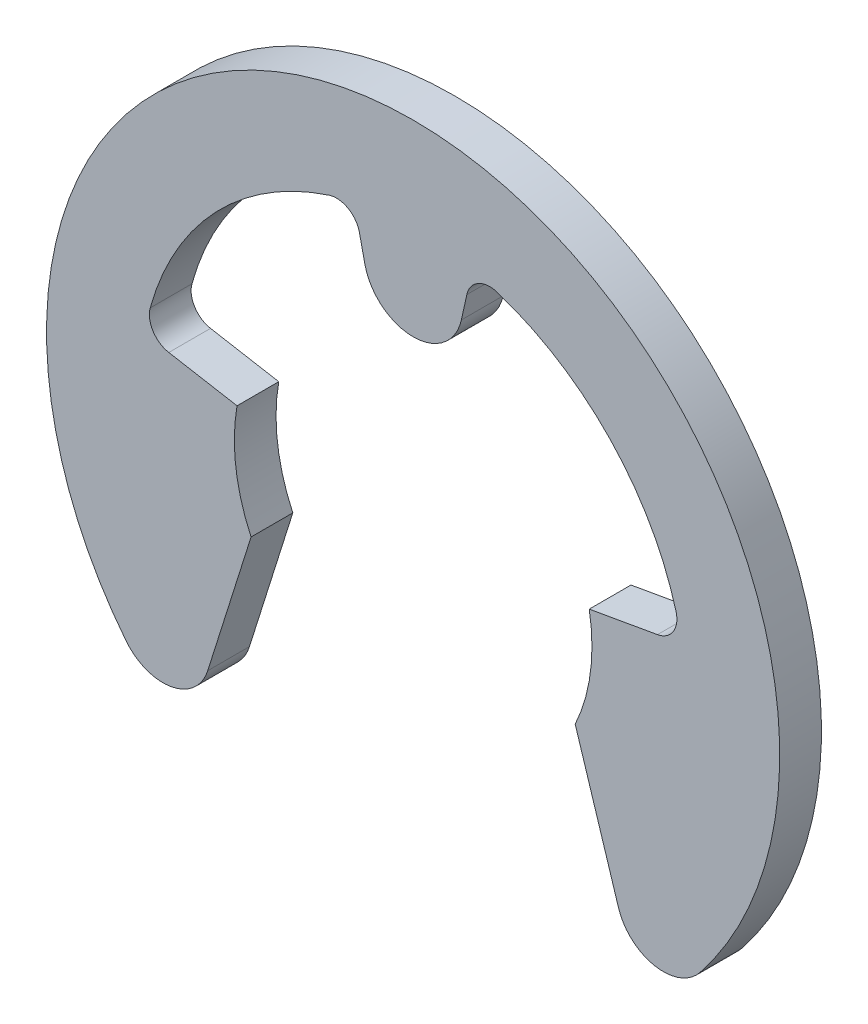
ISO-10303-21;
HEADER;
FILE_DESCRIPTION(('STEP AP214'),'2;1');
FILE_NAME('part.step','',(''),(''),'','','');
FILE_SCHEMA(('AUTOMOTIVE_DESIGN { 1 0 10303 214 1 1 1 1 }'));
ENDSEC;
DATA;
#1=APPLICATION_CONTEXT('core data for automotive mechanical design processes');
#2=APPLICATION_PROTOCOL_DEFINITION('international standard','automotive_design',2000,#1);
#3=PRODUCT_CONTEXT('',#1,'mechanical');
#4=PRODUCT('Part','Part','',(#3));
#5=PRODUCT_RELATED_PRODUCT_CATEGORY('part','',(#4));
#6=PRODUCT_DEFINITION_FORMATION('','',#4);
#7=PRODUCT_DEFINITION_CONTEXT('part definition',#1,'design');
#8=PRODUCT_DEFINITION('design','',#6,#7);
#9=PRODUCT_DEFINITION_SHAPE('','',#8);
#10=(LENGTH_UNIT() NAMED_UNIT(*) SI_UNIT(.MILLI.,.METRE.));
#11=(NAMED_UNIT(*) PLANE_ANGLE_UNIT() SI_UNIT($,.RADIAN.));
#12=(NAMED_UNIT(*) SI_UNIT($,.STERADIAN.) SOLID_ANGLE_UNIT());
#13=UNCERTAINTY_MEASURE_WITH_UNIT(LENGTH_MEASURE(1.E-05),#10,'distance_accuracy_value','');
#14=(GEOMETRIC_REPRESENTATION_CONTEXT(3) GLOBAL_UNCERTAINTY_ASSIGNED_CONTEXT((#13)) GLOBAL_UNIT_ASSIGNED_CONTEXT((#10,
#11,#12)) REPRESENTATION_CONTEXT('',''));
#15=CARTESIAN_POINT('',(0.,0.,0.));
#16=DIRECTION('',(0.,0.,1.));
#17=DIRECTION('',(1.,0.,0.));
#18=AXIS2_PLACEMENT_3D('',#15,#16,#17);
#19=CARTESIAN_POINT('',(0.,0.,-0.7));
#20=DIRECTION('',(0.,0.,1.));
#21=DIRECTION('',(1.,0.,0.));
#22=AXIS2_PLACEMENT_3D('',#19,#20,#21);
#23=CYLINDRICAL_SURFACE('',#22,3.);
#24=CARTESIAN_POINT('',(0.,0.,0.));
#25=DIRECTION('',(0.,0.,-1.));
#26=DIRECTION('',(1.,0.,0.));
#27=AXIS2_PLACEMENT_3D('',#24,#25,#26);
#28=CIRCLE('',#27,3.);
#29=CARTESIAN_POINT('',(2.95442325903663,0.520944533000782,0.));
#30=VERTEX_POINT('',#29);
#31=CARTESIAN_POINT('',(2.71892336110994,-1.26785478522211,0.));
#32=VERTEX_POINT('',#31);
#33=EDGE_CURVE('E192',#30,#32,#28,.T.);
#34=ORIENTED_EDGE('',*,*,#33,.F.);
#35=DIRECTION('',(0.,0.,1.));
#36=VECTOR('',#35,1.);
#37=CARTESIAN_POINT('',(2.95442325903663,0.520944533000782,-0.7));
#38=LINE('',#37,#36);
#39=CARTESIAN_POINT('',(2.95442325903663,0.520944533000782,-0.7));
#40=VERTEX_POINT('',#39);
#41=EDGE_CURVE('E11',#40,#30,#38,.T.);
#42=ORIENTED_EDGE('',*,*,#41,.F.);
#43=CARTESIAN_POINT('',(0.,0.,-0.7));
#44=DIRECTION('',(0.,0.,-1.));
#45=DIRECTION('',(1.,0.,0.));
#46=AXIS2_PLACEMENT_3D('',#43,#44,#45);
#47=CIRCLE('',#46,3.);
#48=CARTESIAN_POINT('',(2.71892336110994,-1.26785478522211,-0.7));
#49=VERTEX_POINT('',#48);
#50=EDGE_CURVE('E242',#40,#49,#47,.T.);
#51=ORIENTED_EDGE('',*,*,#50,.T.);
#52=DIRECTION('',(0.,0.,1.));
#53=VECTOR('',#52,1.);
#54=CARTESIAN_POINT('',(2.71892336110994,-1.26785478522211,-0.7));
#55=LINE('',#54,#53);
#56=EDGE_CURVE('E38',#49,#32,#55,.T.);
#57=ORIENTED_EDGE('',*,*,#56,.T.);
#58=EDGE_LOOP('',(#34,#42,#51,#57));
#59=FACE_BOUND('',#58,.T.);
#60=ADVANCED_FACE('F35',(#59),#23,.F.);
#61=CARTESIAN_POINT('',(2.95442325903663,0.520944533000782,-0.7));
#62=DIRECTION('',(-0.173648177666928,0.984807753012209,0.));
#63=DIRECTION('',(-0.984807753012209,-0.173648177666928,0.));
#64=AXIS2_PLACEMENT_3D('',#61,#62,#63);
#65=PLANE('',#64);
#66=DIRECTION('',(-0.984807753012209,-0.173648177666928,0.));
#67=VECTOR('',#66,1.);
#68=CARTESIAN_POINT('',(2.95442325903663,0.520944533000782,0.));
#69=LINE('',#68,#67);
#70=CARTESIAN_POINT('',(4.09942862119905,0.722839871405881,0.));
#71=VERTEX_POINT('',#70);
#72=EDGE_CURVE('E240',#71,#30,#69,.T.);
#73=ORIENTED_EDGE('',*,*,#72,.F.);
#74=DIRECTION('',(0.,0.,1.));
#75=VECTOR('',#74,1.);
#76=CARTESIAN_POINT('',(4.09942862119905,0.722839871405881,-0.7));
#77=LINE('',#76,#75);
#78=CARTESIAN_POINT('',(4.09942862119905,0.722839871405881,-0.7));
#79=VERTEX_POINT('',#78);
#80=EDGE_CURVE('E44',#79,#71,#77,.T.);
#81=ORIENTED_EDGE('',*,*,#80,.F.);
#82=DIRECTION('',(-0.984807753012209,-0.173648177666928,0.));
#83=VECTOR('',#82,1.);
#84=CARTESIAN_POINT('',(2.95442325903663,0.520944533000782,-0.7));
#85=LINE('',#84,#83);
#86=EDGE_CURVE('E182',#79,#40,#85,.T.);
#87=ORIENTED_EDGE('',*,*,#86,.T.);
#88=ORIENTED_EDGE('',*,*,#41,.T.);
#89=EDGE_LOOP('',(#73,#81,#87,#88));
#90=FACE_BOUND('',#89,.T.);
#91=ADVANCED_FACE('F274',(#90),#65,.T.);
#92=CARTESIAN_POINT('',(4.0310546512427,1.11060792415444,-0.7));
#93=DIRECTION('',(0.,0.,1.));
#94=DIRECTION('',(1.,0.,0.));
#95=AXIS2_PLACEMENT_3D('',#92,#93,#94);
#96=CYLINDRICAL_SURFACE('',#95,0.39375);
#97=CARTESIAN_POINT('',(4.0310546512427,1.11060792415444,0.));
#98=DIRECTION('',(0.,0.,-1.));
#99=DIRECTION('',(1.,0.,0.));
#100=AXIS2_PLACEMENT_3D('',#97,#98,#99);
#101=CIRCLE('',#100,0.39375);
#102=CARTESIAN_POINT('',(4.41066069463326,1.21519432059947,0.));
#103=VERTEX_POINT('',#102);
#104=EDGE_CURVE('E169',#103,#71,#101,.T.);
#105=ORIENTED_EDGE('',*,*,#104,.F.);
#106=DIRECTION('',(0.,0.,1.));
#107=VECTOR('',#106,1.);
#108=CARTESIAN_POINT('',(4.41066069463326,1.21519432059947,-0.7));
#109=LINE('',#108,#107);
#110=CARTESIAN_POINT('',(4.41066069463326,1.21519432059947,-0.7));
#111=VERTEX_POINT('',#110);
#112=EDGE_CURVE('E164',#111,#103,#109,.T.);
#113=ORIENTED_EDGE('',*,*,#112,.F.);
#114=CARTESIAN_POINT('',(4.0310546512427,1.11060792415444,-0.7));
#115=DIRECTION('',(0.,0.,-1.));
#116=DIRECTION('',(1.,0.,0.));
#117=AXIS2_PLACEMENT_3D('',#114,#115,#116);
#118=CIRCLE('',#117,0.39375);
#119=EDGE_CURVE('E167',#111,#79,#118,.T.);
#120=ORIENTED_EDGE('',*,*,#119,.T.);
#121=ORIENTED_EDGE('',*,*,#80,.T.);
#122=EDGE_LOOP('',(#105,#113,#120,#121));
#123=FACE_BOUND('',#122,.T.);
#124=ADVANCED_FACE('F166',(#123),#96,.F.);
#125=CARTESIAN_POINT('',(0.,0.,-0.7));
#126=DIRECTION('',(0.,0.,1.));
#127=DIRECTION('',(1.,0.,0.));
#128=AXIS2_PLACEMENT_3D('',#125,#126,#127);
#129=CYLINDRICAL_SURFACE('',#128,4.575);
#130=CARTESIAN_POINT('',(0.,0.,0.));
#131=DIRECTION('',(0.,0.,-1.));
#132=DIRECTION('',(1.,0.,0.));
#133=AXIS2_PLACEMENT_3D('',#130,#131,#132);
#134=CIRCLE('',#133,4.575);
#135=CARTESIAN_POINT('',(1.40642804224757,4.35345669117997,0.));
#136=VERTEX_POINT('',#135);
#137=EDGE_CURVE('E237',#136,#103,#134,.T.);
#138=ORIENTED_EDGE('',*,*,#137,.F.);
#139=DIRECTION('',(0.,0.,1.));
#140=VECTOR('',#139,1.);
#141=CARTESIAN_POINT('',(1.40642804224757,4.35345669117997,-0.7));
#142=LINE('',#141,#140);
#143=CARTESIAN_POINT('',(1.40642804224757,4.35345669117997,-0.7));
#144=VERTEX_POINT('',#143);
#145=EDGE_CURVE('E174',#144,#136,#142,.T.);
#146=ORIENTED_EDGE('',*,*,#145,.F.);
#147=CARTESIAN_POINT('',(0.,0.,-0.7));
#148=DIRECTION('',(0.,0.,-1.));
#149=DIRECTION('',(1.,0.,0.));
#150=AXIS2_PLACEMENT_3D('',#147,#148,#149);
#151=CIRCLE('',#150,4.575);
#152=EDGE_CURVE('E180',#144,#111,#151,.T.);
#153=ORIENTED_EDGE('',*,*,#152,.T.);
#154=ORIENTED_EDGE('',*,*,#112,.T.);
#155=EDGE_LOOP('',(#138,#146,#153,#154));
#156=FACE_BOUND('',#155,.T.);
#157=ADVANCED_FACE('F184',(#156),#129,.F.);
#158=CARTESIAN_POINT('',(1.28538300582462,3.97877394316858,-0.7));
#159=DIRECTION('',(0.,0.,1.));
#160=DIRECTION('',(1.,0.,0.));
#161=AXIS2_PLACEMENT_3D('',#158,#159,#160);
#162=CYLINDRICAL_SURFACE('',#161,0.39375);
#163=CARTESIAN_POINT('',(1.28538300582462,3.97877394316858,0.));
#164=DIRECTION('',(0.,0.,-1.));
#165=DIRECTION('',(1.,0.,0.));
#166=AXIS2_PLACEMENT_3D('',#163,#164,#165);
#167=CIRCLE('',#166,0.39375);
#168=CARTESIAN_POINT('',(0.900966453021147,4.06399704115671,0.));
#169=VERTEX_POINT('',#168);
#170=EDGE_CURVE('E234',#169,#136,#167,.T.);
#171=ORIENTED_EDGE('',*,*,#170,.F.);
#172=DIRECTION('',(0.,0.,1.));
#173=VECTOR('',#172,1.);
#174=CARTESIAN_POINT('',(0.900966453021147,4.06399704115671,-0.7));
#175=LINE('',#174,#173);
#176=CARTESIAN_POINT('',(0.900966453021147,4.06399704115671,-0.7));
#177=VERTEX_POINT('',#176);
#178=EDGE_CURVE('E246',#177,#169,#175,.T.);
#179=ORIENTED_EDGE('',*,*,#178,.F.);
#180=CARTESIAN_POINT('',(1.28538300582462,3.97877394316858,-0.7));
#181=DIRECTION('',(0.,0.,-1.));
#182=DIRECTION('',(1.,0.,0.));
#183=AXIS2_PLACEMENT_3D('',#180,#181,#182);
#184=CIRCLE('',#183,0.39375);
#185=EDGE_CURVE('E185',#177,#144,#184,.T.);
#186=ORIENTED_EDGE('',*,*,#185,.T.);
#187=ORIENTED_EDGE('',*,*,#145,.T.);
#188=EDGE_LOOP('',(#171,#179,#186,#187));
#189=FACE_BOUND('',#188,.T.);
#190=ADVANCED_FACE('F287',(#189),#162,.F.);
#191=CARTESIAN_POINT('',(0.809034509512549,3.6493188418143,-0.7));
#192=DIRECTION('',(0.976296007119933,-0.216439613938103,0.));
#193=DIRECTION('',(0.216439613938103,0.976296007119933,0.));
#194=AXIS2_PLACEMENT_3D('',#191,#192,#193);
#195=PLANE('',#194);
#196=DIRECTION('',(0.216439613938103,0.976296007119933,0.));
#197=VECTOR('',#196,1.);
#198=CARTESIAN_POINT('',(0.809034509512549,3.6493188418143,0.));
#199=LINE('',#198,#197);
#200=CARTESIAN_POINT('',(0.809034509512549,3.6493188418143,0.));
#201=VERTEX_POINT('',#200);
#202=EDGE_CURVE('E231',#201,#169,#199,.T.);
#203=ORIENTED_EDGE('',*,*,#202,.F.);
#204=DIRECTION('',(0.,0.,1.));
#205=VECTOR('',#204,1.);
#206=CARTESIAN_POINT('',(0.809034509512549,3.6493188418143,-0.7));
#207=LINE('',#206,#205);
#208=CARTESIAN_POINT('',(0.809034509512549,3.6493188418143,-0.7));
#209=VERTEX_POINT('',#208);
#210=EDGE_CURVE('E248',#209,#201,#207,.T.);
#211=ORIENTED_EDGE('',*,*,#210,.F.);
#212=DIRECTION('',(0.216439613938103,0.976296007119933,0.));
#213=VECTOR('',#212,1.);
#214=CARTESIAN_POINT('',(0.809034509512549,3.6493188418143,-0.7));
#215=LINE('',#214,#213);
#216=EDGE_CURVE('E187',#209,#177,#215,.T.);
#217=ORIENTED_EDGE('',*,*,#216,.T.);
#218=ORIENTED_EDGE('',*,*,#178,.T.);
#219=EDGE_LOOP('',(#203,#211,#217,#218));
#220=FACE_BOUND('',#219,.T.);
#221=ADVANCED_FACE('F290',(#220),#195,.T.);
#222=CARTESIAN_POINT('',(0.,3.82867747446718,-0.7));
#223=DIRECTION('',(0.,0.,1.));
#224=DIRECTION('',(1.,0.,0.));
#225=AXIS2_PLACEMENT_3D('',#222,#223,#224);
#226=CYLINDRICAL_SURFACE('',#225,0.828677474467191);
#227=CARTESIAN_POINT('',(0.,3.82867747446718,0.));
#228=DIRECTION('',(0.,0.,1.));
#229=DIRECTION('',(1.,0.,0.));
#230=AXIS2_PLACEMENT_3D('',#227,#228,#229);
#231=CIRCLE('',#230,0.828677474467191);
#232=CARTESIAN_POINT('',(-0.809034509512549,3.6493188418143,0.));
#233=VERTEX_POINT('',#232);
#234=EDGE_CURVE('E228',#233,#201,#231,.T.);
#235=ORIENTED_EDGE('',*,*,#234,.F.);
#236=DIRECTION('',(0.,0.,1.));
#237=VECTOR('',#236,1.);
#238=CARTESIAN_POINT('',(-0.809034509512549,3.6493188418143,-0.7));
#239=LINE('',#238,#237);
#240=CARTESIAN_POINT('',(-0.809034509512549,3.6493188418143,-0.7));
#241=VERTEX_POINT('',#240);
#242=EDGE_CURVE('E250',#241,#233,#239,.T.);
#243=ORIENTED_EDGE('',*,*,#242,.F.);
#244=CARTESIAN_POINT('',(0.,3.82867747446718,-0.7));
#245=DIRECTION('',(0.,0.,1.));
#246=DIRECTION('',(1.,0.,0.));
#247=AXIS2_PLACEMENT_3D('',#244,#245,#246);
#248=CIRCLE('',#247,0.828677474467191);
#249=EDGE_CURVE('E498',#241,#209,#248,.T.);
#250=ORIENTED_EDGE('',*,*,#249,.T.);
#251=ORIENTED_EDGE('',*,*,#210,.T.);
#252=EDGE_LOOP('',(#235,#243,#250,#251));
#253=FACE_BOUND('',#252,.T.);
#254=ADVANCED_FACE('F294',(#253),#226,.T.);
#255=CARTESIAN_POINT('',(-0.809034509512549,3.6493188418143,-0.7));
#256=DIRECTION('',(-0.976296007119933,-0.216439613938103,0.));
#257=DIRECTION('',(0.216439613938103,-0.976296007119933,0.));
#258=AXIS2_PLACEMENT_3D('',#255,#256,#257);
#259=PLANE('',#258);
#260=DIRECTION('',(0.216439613938103,-0.976296007119933,0.));
#261=VECTOR('',#260,1.);
#262=CARTESIAN_POINT('',(-0.809034509512549,3.6493188418143,0.));
#263=LINE('',#262,#261);
#264=CARTESIAN_POINT('',(-0.900966453021147,4.06399704115671,0.));
#265=VERTEX_POINT('',#264);
#266=EDGE_CURVE('E225',#265,#233,#263,.T.);
#267=ORIENTED_EDGE('',*,*,#266,.F.);
#268=DIRECTION('',(0.,0.,1.));
#269=VECTOR('',#268,1.);
#270=CARTESIAN_POINT('',(-0.900966453021147,4.06399704115671,-0.7));
#271=LINE('',#270,#269);
#272=CARTESIAN_POINT('',(-0.900966453021147,4.06399704115671,-0.7));
#273=VERTEX_POINT('',#272);
#274=EDGE_CURVE('E252',#273,#265,#271,.T.);
#275=ORIENTED_EDGE('',*,*,#274,.F.);
#276=DIRECTION('',(0.216439613938103,-0.976296007119933,0.));
#277=VECTOR('',#276,1.);
#278=CARTESIAN_POINT('',(-0.809034509512549,3.6493188418143,-0.7));
#279=LINE('',#278,#277);
#280=EDGE_CURVE('E502',#273,#241,#279,.T.);
#281=ORIENTED_EDGE('',*,*,#280,.T.);
#282=ORIENTED_EDGE('',*,*,#242,.T.);
#283=EDGE_LOOP('',(#267,#275,#281,#282));
#284=FACE_BOUND('',#283,.T.);
#285=ADVANCED_FACE('F298',(#284),#259,.T.);
#286=CARTESIAN_POINT('',(-1.28538300582462,3.97877394316858,-0.7));
#287=DIRECTION('',(0.,0.,1.));
#288=DIRECTION('',(1.,0.,0.));
#289=AXIS2_PLACEMENT_3D('',#286,#287,#288);
#290=CYLINDRICAL_SURFACE('',#289,0.39375);
#291=CARTESIAN_POINT('',(-1.28538300582462,3.97877394316858,0.));
#292=DIRECTION('',(0.,0.,-1.));
#293=DIRECTION('',(1.,0.,0.));
#294=AXIS2_PLACEMENT_3D('',#291,#292,#293);
#295=CIRCLE('',#294,0.39375);
#296=CARTESIAN_POINT('',(-1.40642804224757,4.35345669117997,0.));
#297=VERTEX_POINT('',#296);
#298=EDGE_CURVE('E222',#297,#265,#295,.T.);
#299=ORIENTED_EDGE('',*,*,#298,.F.);
#300=DIRECTION('',(0.,0.,1.));
#301=VECTOR('',#300,1.);
#302=CARTESIAN_POINT('',(-1.40642804224757,4.35345669117997,-0.7));
#303=LINE('',#302,#301);
#304=CARTESIAN_POINT('',(-1.40642804224757,4.35345669117997,-0.7));
#305=VERTEX_POINT('',#304);
#306=EDGE_CURVE('E254',#305,#297,#303,.T.);
#307=ORIENTED_EDGE('',*,*,#306,.F.);
#308=CARTESIAN_POINT('',(-1.28538300582462,3.97877394316858,-0.7));
#309=DIRECTION('',(0.,0.,-1.));
#310=DIRECTION('',(1.,0.,0.));
#311=AXIS2_PLACEMENT_3D('',#308,#309,#310);
#312=CIRCLE('',#311,0.39375);
#313=EDGE_CURVE('E491',#305,#273,#312,.T.);
#314=ORIENTED_EDGE('',*,*,#313,.T.);
#315=ORIENTED_EDGE('',*,*,#274,.T.);
#316=EDGE_LOOP('',(#299,#307,#314,#315));
#317=FACE_BOUND('',#316,.T.);
#318=ADVANCED_FACE('F302',(#317),#290,.F.);
#319=CARTESIAN_POINT('',(0.,0.,-0.7));
#320=DIRECTION('',(0.,0.,1.));
#321=DIRECTION('',(1.,0.,0.));
#322=AXIS2_PLACEMENT_3D('',#319,#320,#321);
#323=CYLINDRICAL_SURFACE('',#322,4.575);
#324=CARTESIAN_POINT('',(0.,0.,0.));
#325=DIRECTION('',(0.,0.,-1.));
#326=DIRECTION('',(1.,0.,0.));
#327=AXIS2_PLACEMENT_3D('',#324,#325,#326);
#328=CIRCLE('',#327,4.575);
#329=CARTESIAN_POINT('',(-4.41066069463326,1.21519432059948,0.));
#330=VERTEX_POINT('',#329);
#331=EDGE_CURVE('E219',#330,#297,#328,.T.);
#332=ORIENTED_EDGE('',*,*,#331,.F.);
#333=DIRECTION('',(0.,0.,1.));
#334=VECTOR('',#333,1.);
#335=CARTESIAN_POINT('',(-4.41066069463326,1.21519432059948,-0.7));
#336=LINE('',#335,#334);
#337=CARTESIAN_POINT('',(-4.41066069463326,1.21519432059948,-0.7));
#338=VERTEX_POINT('',#337);
#339=EDGE_CURVE('E256',#338,#330,#336,.T.);
#340=ORIENTED_EDGE('',*,*,#339,.F.);
#341=CARTESIAN_POINT('',(0.,0.,-0.7));
#342=DIRECTION('',(0.,0.,-1.));
#343=DIRECTION('',(1.,0.,0.));
#344=AXIS2_PLACEMENT_3D('',#341,#342,#343);
#345=CIRCLE('',#344,4.575);
#346=EDGE_CURVE('E487',#338,#305,#345,.T.);
#347=ORIENTED_EDGE('',*,*,#346,.T.);
#348=ORIENTED_EDGE('',*,*,#306,.T.);
#349=EDGE_LOOP('',(#332,#340,#347,#348));
#350=FACE_BOUND('',#349,.T.);
#351=ADVANCED_FACE('F306',(#350),#323,.F.);
#352=CARTESIAN_POINT('',(-4.0310546512427,1.11060792415444,-0.7));
#353=DIRECTION('',(0.,0.,1.));
#354=DIRECTION('',(1.,0.,0.));
#355=AXIS2_PLACEMENT_3D('',#352,#353,#354);
#356=CYLINDRICAL_SURFACE('',#355,0.39375);
#357=CARTESIAN_POINT('',(-4.0310546512427,1.11060792415444,0.));
#358=DIRECTION('',(0.,0.,-1.));
#359=DIRECTION('',(1.,0.,0.));
#360=AXIS2_PLACEMENT_3D('',#357,#358,#359);
#361=CIRCLE('',#360,0.39375);
#362=CARTESIAN_POINT('',(-4.09942862119905,0.72283987140588,0.));
#363=VERTEX_POINT('',#362);
#364=EDGE_CURVE('E216',#363,#330,#361,.T.);
#365=ORIENTED_EDGE('',*,*,#364,.F.);
#366=DIRECTION('',(0.,0.,1.));
#367=VECTOR('',#366,1.);
#368=CARTESIAN_POINT('',(-4.09942862119905,0.72283987140588,-0.7));
#369=LINE('',#368,#367);
#370=CARTESIAN_POINT('',(-4.09942862119905,0.72283987140588,-0.7));
#371=VERTEX_POINT('',#370);
#372=EDGE_CURVE('E258',#371,#363,#369,.T.);
#373=ORIENTED_EDGE('',*,*,#372,.F.);
#374=CARTESIAN_POINT('',(-4.0310546512427,1.11060792415444,-0.7));
#375=DIRECTION('',(0.,0.,-1.));
#376=DIRECTION('',(1.,0.,0.));
#377=AXIS2_PLACEMENT_3D('',#374,#375,#376);
#378=CIRCLE('',#377,0.39375);
#379=EDGE_CURVE('E508',#371,#338,#378,.T.);
#380=ORIENTED_EDGE('',*,*,#379,.T.);
#381=ORIENTED_EDGE('',*,*,#339,.T.);
#382=EDGE_LOOP('',(#365,#373,#380,#381));
#383=FACE_BOUND('',#382,.T.);
#384=ADVANCED_FACE('F310',(#383),#356,.F.);
#385=CARTESIAN_POINT('',(-2.95442325903663,0.520944533000782,-0.7));
#386=DIRECTION('',(0.173648177666928,0.984807753012209,0.));
#387=DIRECTION('',(-0.984807753012209,0.173648177666928,0.));
#388=AXIS2_PLACEMENT_3D('',#385,#386,#387);
#389=PLANE('',#388);
#390=DIRECTION('',(-0.984807753012209,0.173648177666928,0.));
#391=VECTOR('',#390,1.);
#392=CARTESIAN_POINT('',(-2.95442325903663,0.520944533000782,0.));
#393=LINE('',#392,#391);
#394=CARTESIAN_POINT('',(-2.95442325903663,0.520944533000782,0.));
#395=VERTEX_POINT('',#394);
#396=EDGE_CURVE('E213',#395,#363,#393,.T.);
#397=ORIENTED_EDGE('',*,*,#396,.F.);
#398=DIRECTION('',(0.,0.,1.));
#399=VECTOR('',#398,1.);
#400=CARTESIAN_POINT('',(-2.95442325903663,0.520944533000782,-0.7));
#401=LINE('',#400,#399);
#402=CARTESIAN_POINT('',(-2.95442325903663,0.520944533000782,-0.7));
#403=VERTEX_POINT('',#402);
#404=EDGE_CURVE('E260',#403,#395,#401,.T.);
#405=ORIENTED_EDGE('',*,*,#404,.F.);
#406=DIRECTION('',(-0.984807753012209,0.173648177666928,0.));
#407=VECTOR('',#406,1.);
#408=CARTESIAN_POINT('',(-2.95442325903663,0.520944533000782,-0.7));
#409=LINE('',#408,#407);
#410=EDGE_CURVE('E480',#403,#371,#409,.T.);
#411=ORIENTED_EDGE('',*,*,#410,.T.);
#412=ORIENTED_EDGE('',*,*,#372,.T.);
#413=EDGE_LOOP('',(#397,#405,#411,#412));
#414=FACE_BOUND('',#413,.T.);
#415=ADVANCED_FACE('F314',(#414),#389,.T.);
#416=CARTESIAN_POINT('',(0.,0.,-0.7));
#417=DIRECTION('',(0.,0.,1.));
#418=DIRECTION('',(1.,0.,0.));
#419=AXIS2_PLACEMENT_3D('',#416,#417,#418);
#420=CYLINDRICAL_SURFACE('',#419,3.);
#421=CARTESIAN_POINT('',(0.,0.,0.));
#422=DIRECTION('',(0.,0.,-1.));
#423=DIRECTION('',(1.,0.,0.));
#424=AXIS2_PLACEMENT_3D('',#421,#422,#423);
#425=CIRCLE('',#424,3.);
#426=CARTESIAN_POINT('',(-2.71892336110994,-1.26785478522211,0.));
#427=VERTEX_POINT('',#426);
#428=EDGE_CURVE('E210',#427,#395,#425,.T.);
#429=ORIENTED_EDGE('',*,*,#428,.F.);
#430=DIRECTION('',(0.,0.,1.));
#431=VECTOR('',#430,1.);
#432=CARTESIAN_POINT('',(-2.71892336110994,-1.26785478522211,-0.7));
#433=LINE('',#432,#431);
#434=CARTESIAN_POINT('',(-2.71892336110994,-1.26785478522211,-0.7));
#435=VERTEX_POINT('',#434);
#436=EDGE_CURVE('E262',#435,#427,#433,.T.);
#437=ORIENTED_EDGE('',*,*,#436,.F.);
#438=CARTESIAN_POINT('',(0.,0.,-0.7));
#439=DIRECTION('',(0.,0.,-1.));
#440=DIRECTION('',(1.,0.,0.));
#441=AXIS2_PLACEMENT_3D('',#438,#439,#440);
#442=CIRCLE('',#441,3.);
#443=EDGE_CURVE('E476',#435,#403,#442,.T.);
#444=ORIENTED_EDGE('',*,*,#443,.T.);
#445=ORIENTED_EDGE('',*,*,#404,.T.);
#446=EDGE_LOOP('',(#429,#437,#444,#445));
#447=FACE_BOUND('',#446,.T.);
#448=ADVANCED_FACE('F318',(#447),#420,.F.);
#449=CARTESIAN_POINT('',(-2.71892336110994,-1.26785478522211,-0.7));
#450=DIRECTION('',(0.953716950748227,-0.300705799504273,0.));
#451=DIRECTION('',(0.300705799504273,0.953716950748227,0.));
#452=AXIS2_PLACEMENT_3D('',#449,#450,#451);
#453=PLANE('',#452);
#454=DIRECTION('',(0.300705799504273,0.953716950748227,0.));
#455=VECTOR('',#454,1.);
#456=CARTESIAN_POINT('',(-2.71892336110994,-1.26785478522211,0.));
#457=LINE('',#456,#455);
#458=CARTESIAN_POINT('',(-3.44617975649715,-3.57441738881757,0.));
#459=VERTEX_POINT('',#458);
#460=EDGE_CURVE('E207',#459,#427,#457,.T.);
#461=ORIENTED_EDGE('',*,*,#460,.F.);
#462=DIRECTION('',(0.,0.,1.));
#463=VECTOR('',#462,1.);
#464=CARTESIAN_POINT('',(-3.44617975649715,-3.57441738881757,-0.7));
#465=LINE('',#464,#463);
#466=CARTESIAN_POINT('',(-3.44617975649715,-3.57441738881757,-0.7));
#467=VERTEX_POINT('',#466);
#468=EDGE_CURVE('E264',#467,#459,#465,.T.);
#469=ORIENTED_EDGE('',*,*,#468,.F.);
#470=DIRECTION('',(0.300705799504273,0.953716950748227,0.));
#471=VECTOR('',#470,1.);
#472=CARTESIAN_POINT('',(-2.71892336110994,-1.26785478522211,-0.7));
#473=LINE('',#472,#471);
#474=EDGE_CURVE('E512',#467,#435,#473,.T.);
#475=ORIENTED_EDGE('',*,*,#474,.T.);
#476=ORIENTED_EDGE('',*,*,#436,.T.);
#477=EDGE_LOOP('',(#461,#469,#475,#476));
#478=FACE_BOUND('',#477,.T.);
#479=ADVANCED_FACE('F322',(#478),#453,.T.);
#480=CARTESIAN_POINT('',(-4.19723185521138,-3.33761157170796,-0.7));
#481=DIRECTION('',(0.,0.,1.));
#482=DIRECTION('',(1.,0.,0.));
#483=AXIS2_PLACEMENT_3D('',#480,#481,#482);
#484=CYLINDRICAL_SURFACE('',#483,0.7875);
#485=CARTESIAN_POINT('',(-4.19723185521138,-3.33761157170796,0.));
#486=DIRECTION('',(0.,0.,1.));
#487=DIRECTION('',(1.,0.,0.));
#488=AXIS2_PLACEMENT_3D('',#485,#486,#487);
#489=CIRCLE('',#488,0.7875);
#490=CARTESIAN_POINT('',(-4.81360856122144,-3.82775033398675,0.));
#491=VERTEX_POINT('',#490);
#492=EDGE_CURVE('E204',#491,#459,#489,.T.);
#493=ORIENTED_EDGE('',*,*,#492,.F.);
#494=DIRECTION('',(0.,0.,1.));
#495=VECTOR('',#494,1.);
#496=CARTESIAN_POINT('',(-4.81360856122144,-3.82775033398675,-0.7));
#497=LINE('',#496,#495);
#498=CARTESIAN_POINT('',(-4.81360856122144,-3.82775033398675,-0.7));
#499=VERTEX_POINT('',#498);
#500=EDGE_CURVE('E266',#499,#491,#497,.T.);
#501=ORIENTED_EDGE('',*,*,#500,.F.);
#502=CARTESIAN_POINT('',(-4.19723185521138,-3.33761157170796,-0.7));
#503=DIRECTION('',(0.,0.,1.));
#504=DIRECTION('',(1.,0.,0.));
#505=AXIS2_PLACEMENT_3D('',#502,#503,#504);
#506=CIRCLE('',#505,0.7875);
#507=EDGE_CURVE('E469',#499,#467,#506,.T.);
#508=ORIENTED_EDGE('',*,*,#507,.T.);
#509=ORIENTED_EDGE('',*,*,#468,.T.);
#510=EDGE_LOOP('',(#493,#501,#508,#509));
#511=FACE_BOUND('',#510,.T.);
#512=ADVANCED_FACE('F326',(#511),#484,.T.);
#513=CARTESIAN_POINT('',(0.,0.,-0.7));
#514=DIRECTION('',(0.,0.,1.));
#515=DIRECTION('',(1.,0.,0.));
#516=AXIS2_PLACEMENT_3D('',#513,#514,#515);
#517=CYLINDRICAL_SURFACE('',#516,6.15);
#518=CARTESIAN_POINT('',(0.,0.,0.));
#519=DIRECTION('',(0.,0.,1.));
#520=DIRECTION('',(1.,0.,0.));
#521=AXIS2_PLACEMENT_3D('',#518,#519,#520);
#522=CIRCLE('',#521,6.15);
#523=CARTESIAN_POINT('',(4.81360856122144,-3.82775033398675,0.));
#524=VERTEX_POINT('',#523);
#525=EDGE_CURVE('E201',#524,#491,#522,.T.);
#526=ORIENTED_EDGE('',*,*,#525,.F.);
#527=DIRECTION('',(0.,0.,1.));
#528=VECTOR('',#527,1.);
#529=CARTESIAN_POINT('',(4.81360856122144,-3.82775033398675,-0.7));
#530=LINE('',#529,#528);
#531=CARTESIAN_POINT('',(4.81360856122144,-3.82775033398675,-0.7));
#532=VERTEX_POINT('',#531);
#533=EDGE_CURVE('E268',#532,#524,#530,.T.);
#534=ORIENTED_EDGE('',*,*,#533,.F.);
#535=CARTESIAN_POINT('',(0.,0.,-0.7));
#536=DIRECTION('',(0.,0.,1.));
#537=DIRECTION('',(1.,0.,0.));
#538=AXIS2_PLACEMENT_3D('',#535,#536,#537);
#539=CIRCLE('',#538,6.15);
#540=EDGE_CURVE('E465',#532,#499,#539,.T.);
#541=ORIENTED_EDGE('',*,*,#540,.T.);
#542=ORIENTED_EDGE('',*,*,#500,.T.);
#543=EDGE_LOOP('',(#526,#534,#541,#542));
#544=FACE_BOUND('',#543,.T.);
#545=ADVANCED_FACE('F330',(#544),#517,.T.);
#546=CARTESIAN_POINT('',(4.19723185521138,-3.33761157170796,-0.7));
#547=DIRECTION('',(0.,0.,1.));
#548=DIRECTION('',(1.,0.,0.));
#549=AXIS2_PLACEMENT_3D('',#546,#547,#548);
#550=CYLINDRICAL_SURFACE('',#549,0.7875);
#551=CARTESIAN_POINT('',(4.19723185521138,-3.33761157170796,0.));
#552=DIRECTION('',(0.,0.,1.));
#553=DIRECTION('',(1.,0.,0.));
#554=AXIS2_PLACEMENT_3D('',#551,#552,#553);
#555=CIRCLE('',#554,0.7875);
#556=CARTESIAN_POINT('',(3.44617975649715,-3.57441738881757,0.));
#557=VERTEX_POINT('',#556);
#558=EDGE_CURVE('E198',#557,#524,#555,.T.);
#559=ORIENTED_EDGE('',*,*,#558,.F.);
#560=DIRECTION('',(0.,0.,1.));
#561=VECTOR('',#560,1.);
#562=CARTESIAN_POINT('',(3.44617975649715,-3.57441738881757,-0.7));
#563=LINE('',#562,#561);
#564=CARTESIAN_POINT('',(3.44617975649715,-3.57441738881757,-0.7));
#565=VERTEX_POINT('',#564);
#566=EDGE_CURVE('E269',#565,#557,#563,.T.);
#567=ORIENTED_EDGE('',*,*,#566,.F.);
#568=CARTESIAN_POINT('',(4.19723185521138,-3.33761157170796,-0.7));
#569=DIRECTION('',(0.,0.,1.));
#570=DIRECTION('',(1.,0.,0.));
#571=AXIS2_PLACEMENT_3D('',#568,#569,#570);
#572=CIRCLE('',#571,0.7875);
#573=EDGE_CURVE('E516',#565,#532,#572,.T.);
#574=ORIENTED_EDGE('',*,*,#573,.T.);
#575=ORIENTED_EDGE('',*,*,#533,.T.);
#576=EDGE_LOOP('',(#559,#567,#574,#575));
#577=FACE_BOUND('',#576,.T.);
#578=ADVANCED_FACE('F334',(#577),#550,.T.);
#579=CARTESIAN_POINT('',(2.71892336110994,-1.26785478522211,-0.7));
#580=DIRECTION('',(-0.953716950748227,-0.300705799504273,0.));
#581=DIRECTION('',(0.300705799504273,-0.953716950748227,0.));
#582=AXIS2_PLACEMENT_3D('',#579,#580,#581);
#583=PLANE('',#582);
#584=DIRECTION('',(0.300705799504273,-0.953716950748227,0.));
#585=VECTOR('',#584,1.);
#586=CARTESIAN_POINT('',(2.71892336110994,-1.26785478522211,0.));
#587=LINE('',#586,#585);
#588=EDGE_CURVE('E195',#32,#557,#587,.T.);
#589=ORIENTED_EDGE('',*,*,#588,.F.);
#590=ORIENTED_EDGE('',*,*,#56,.F.);
#591=DIRECTION('',(0.300705799504273,-0.953716950748227,0.));
#592=VECTOR('',#591,1.);
#593=CARTESIAN_POINT('',(2.71892336110994,-1.26785478522211,-0.7));
#594=LINE('',#593,#592);
#595=EDGE_CURVE('E518',#49,#565,#594,.T.);
#596=ORIENTED_EDGE('',*,*,#595,.T.);
#597=ORIENTED_EDGE('',*,*,#566,.T.);
#598=EDGE_LOOP('',(#589,#590,#596,#597));
#599=FACE_BOUND('',#598,.T.);
#600=ADVANCED_FACE('F271',(#599),#583,.T.);
#601=CARTESIAN_POINT('',(0.,0.,-0.7));
#602=DIRECTION('',(0.,0.,1.));
#603=DIRECTION('',(1.,0.,0.));
#604=AXIS2_PLACEMENT_3D('',#601,#602,#603);
#605=PLANE('',#604);
#606=ORIENTED_EDGE('',*,*,#50,.F.);
#607=ORIENTED_EDGE('',*,*,#86,.F.);
#608=ORIENTED_EDGE('',*,*,#119,.F.);
#609=ORIENTED_EDGE('',*,*,#152,.F.);
#610=ORIENTED_EDGE('',*,*,#185,.F.);
#611=ORIENTED_EDGE('',*,*,#216,.F.);
#612=ORIENTED_EDGE('',*,*,#249,.F.);
#613=ORIENTED_EDGE('',*,*,#280,.F.);
#614=ORIENTED_EDGE('',*,*,#313,.F.);
#615=ORIENTED_EDGE('',*,*,#346,.F.);
#616=ORIENTED_EDGE('',*,*,#379,.F.);
#617=ORIENTED_EDGE('',*,*,#410,.F.);
#618=ORIENTED_EDGE('',*,*,#443,.F.);
#619=ORIENTED_EDGE('',*,*,#474,.F.);
#620=ORIENTED_EDGE('',*,*,#507,.F.);
#621=ORIENTED_EDGE('',*,*,#540,.F.);
#622=ORIENTED_EDGE('',*,*,#573,.F.);
#623=ORIENTED_EDGE('',*,*,#595,.F.);
#624=EDGE_LOOP('',(#606,#607,#608,#609,#610,#611,#612,#613,#614,#615,#616,#617,#618,#619,#620,
#621,#622,#623));
#625=FACE_BOUND('',#624,.T.);
#626=ADVANCED_FACE('F178',(#625),#605,.F.);
#627=CARTESIAN_POINT('',(0.,0.,0.));
#628=DIRECTION('',(0.,0.,1.));
#629=DIRECTION('',(1.,0.,0.));
#630=AXIS2_PLACEMENT_3D('',#627,#628,#629);
#631=PLANE('',#630);
#632=ORIENTED_EDGE('',*,*,#33,.T.);
#633=ORIENTED_EDGE('',*,*,#588,.T.);
#634=ORIENTED_EDGE('',*,*,#558,.T.);
#635=ORIENTED_EDGE('',*,*,#525,.T.);
#636=ORIENTED_EDGE('',*,*,#492,.T.);
#637=ORIENTED_EDGE('',*,*,#460,.T.);
#638=ORIENTED_EDGE('',*,*,#428,.T.);
#639=ORIENTED_EDGE('',*,*,#396,.T.);
#640=ORIENTED_EDGE('',*,*,#364,.T.);
#641=ORIENTED_EDGE('',*,*,#331,.T.);
#642=ORIENTED_EDGE('',*,*,#298,.T.);
#643=ORIENTED_EDGE('',*,*,#266,.T.);
#644=ORIENTED_EDGE('',*,*,#234,.T.);
#645=ORIENTED_EDGE('',*,*,#202,.T.);
#646=ORIENTED_EDGE('',*,*,#170,.T.);
#647=ORIENTED_EDGE('',*,*,#137,.T.);
#648=ORIENTED_EDGE('',*,*,#104,.T.);
#649=ORIENTED_EDGE('',*,*,#72,.T.);
#650=EDGE_LOOP('',(#632,#633,#634,#635,#636,#637,#638,#639,#640,#641,#642,#643,#644,#645,#646,
#647,#648,#649));
#651=FACE_BOUND('',#650,.T.);
#652=ADVANCED_FACE('F273',(#651),#631,.T.);
#653=CLOSED_SHELL('',(#60,#91,#124,#157,#190,#221,#254,#285,#318,#351,#384,#415,#448,#479,#512,
#545,#578,#600,#626,#652));
#654=MANIFOLD_SOLID_BREP('B2',#653);
#655=ADVANCED_BREP_SHAPE_REPRESENTATION('',(#18,#654),#14);
#656=SHAPE_DEFINITION_REPRESENTATION(#9,#655);
ENDSEC;
END-ISO-10303-21;
